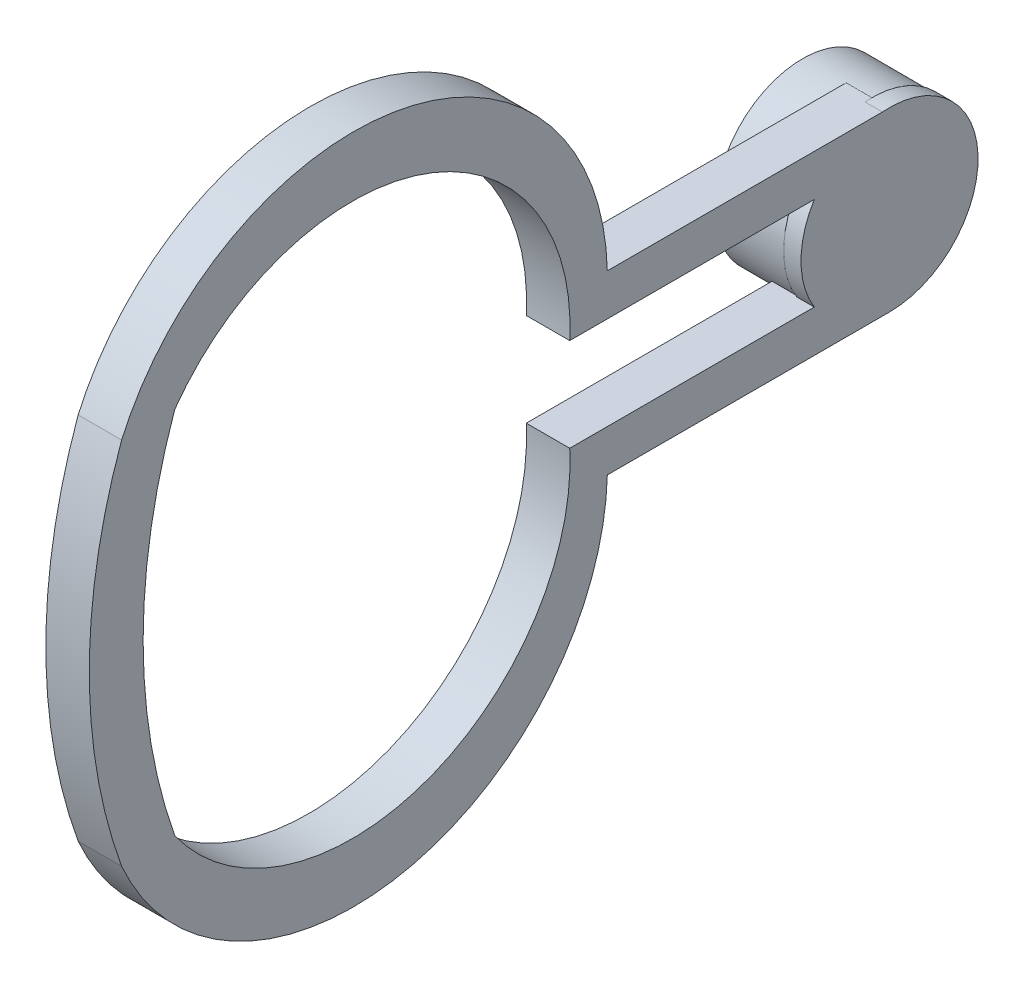
ISO-10303-21;
HEADER;
FILE_DESCRIPTION(('STEP AP214'),'2;1');
FILE_NAME('part.step','',(''),(''),'','','');
FILE_SCHEMA(('AUTOMOTIVE_DESIGN { 1 0 10303 214 1 1 1 1 }'));
ENDSEC;
DATA;
#1=APPLICATION_CONTEXT('core data for automotive mechanical design processes');
#2=APPLICATION_PROTOCOL_DEFINITION('international standard','automotive_design',2000,#1);
#3=PRODUCT_CONTEXT('',#1,'mechanical');
#4=PRODUCT('Part','Part','',(#3));
#5=PRODUCT_RELATED_PRODUCT_CATEGORY('part','',(#4));
#6=PRODUCT_DEFINITION_FORMATION('','',#4);
#7=PRODUCT_DEFINITION_CONTEXT('part definition',#1,'design');
#8=PRODUCT_DEFINITION('design','',#6,#7);
#9=PRODUCT_DEFINITION_SHAPE('','',#8);
#10=(LENGTH_UNIT() NAMED_UNIT(*) SI_UNIT(.MILLI.,.METRE.));
#11=(NAMED_UNIT(*) PLANE_ANGLE_UNIT() SI_UNIT($,.RADIAN.));
#12=(NAMED_UNIT(*) SI_UNIT($,.STERADIAN.) SOLID_ANGLE_UNIT());
#13=UNCERTAINTY_MEASURE_WITH_UNIT(LENGTH_MEASURE(1.E-05),#10,'distance_accuracy_value','');
#14=(GEOMETRIC_REPRESENTATION_CONTEXT(3) GLOBAL_UNCERTAINTY_ASSIGNED_CONTEXT((#13)) GLOBAL_UNIT_ASSIGNED_CONTEXT((#10,
#11,#12)) REPRESENTATION_CONTEXT('',''));
#15=CARTESIAN_POINT('',(0.,0.,0.));
#16=DIRECTION('',(0.,0.,1.));
#17=DIRECTION('',(1.,0.,0.));
#18=AXIS2_PLACEMENT_3D('',#15,#16,#17);
#19=CARTESIAN_POINT('',(2.032,2.7231335401423,0.));
#20=DIRECTION('',(0.,-1.,0.));
#21=DIRECTION('',(0.,0.,-1.));
#22=AXIS2_PLACEMENT_3D('',#19,#20,#21);
#23=PLANE('',#22);
#24=DIRECTION('',(0.,0.,1.));
#25=VECTOR('',#24,1.);
#26=CARTESIAN_POINT('',(-0.508,2.7231335401423,0.));
#27=LINE('',#26,#25);
#28=CARTESIAN_POINT('',(-0.508,2.7231335401423,4.32551958677977));
#29=VERTEX_POINT('',#28);
#30=CARTESIAN_POINT('',(-0.508,2.72313354014231,18.6868210524946));
#31=VERTEX_POINT('',#30);
#32=EDGE_CURVE('E166',#29,#31,#27,.T.);
#33=ORIENTED_EDGE('',*,*,#32,.F.);
#34=DIRECTION('',(1.,0.,0.));
#35=VECTOR('',#34,1.);
#36=CARTESIAN_POINT('',(-3.048,2.7231335401423,4.32551958677977));
#37=LINE('',#36,#35);
#38=CARTESIAN_POINT('',(1.016,2.7231335401423,4.32551958677977));
#39=VERTEX_POINT('',#38);
#40=EDGE_CURVE('E159',#29,#39,#37,.T.);
#41=ORIENTED_EDGE('',*,*,#40,.T.);
#42=DIRECTION('',(0.,0.,-1.));
#43=VECTOR('',#42,1.);
#44=CARTESIAN_POINT('',(1.016,2.7231335401423,0.));
#45=LINE('',#44,#43);
#46=CARTESIAN_POINT('',(1.016,2.7231335401423,4.39833654890219));
#47=VERTEX_POINT('',#46);
#48=EDGE_CURVE('E60',#47,#39,#45,.T.);
#49=ORIENTED_EDGE('',*,*,#48,.F.);
#50=DIRECTION('',(-1.,0.,0.));
#51=VECTOR('',#50,1.);
#52=CARTESIAN_POINT('',(2.032,2.7231335401423,4.39833654890219));
#53=LINE('',#52,#51);
#54=CARTESIAN_POINT('',(2.032,2.7231335401423,4.39833654890219));
#55=VERTEX_POINT('',#54);
#56=EDGE_CURVE('E274',#55,#47,#53,.T.);
#57=ORIENTED_EDGE('',*,*,#56,.F.);
#58=DIRECTION('',(0.,0.,1.));
#59=VECTOR('',#58,1.);
#60=CARTESIAN_POINT('',(2.032,2.7231335401423,0.));
#61=LINE('',#60,#59);
#62=CARTESIAN_POINT('',(2.032,2.72313354014231,18.6868210524946));
#63=VERTEX_POINT('',#62);
#64=EDGE_CURVE('E213',#55,#63,#61,.T.);
#65=ORIENTED_EDGE('',*,*,#64,.T.);
#66=DIRECTION('',(-1.,0.,0.));
#67=VECTOR('',#66,1.);
#68=CARTESIAN_POINT('',(2.032,2.72313354014231,18.6868210524946));
#69=LINE('',#68,#67);
#70=EDGE_CURVE('E240',#63,#31,#69,.T.);
#71=ORIENTED_EDGE('',*,*,#70,.T.);
#72=EDGE_LOOP('',(#33,#41,#49,#57,#65,#71));
#73=FACE_BOUND('',#72,.T.);
#74=ADVANCED_FACE('F38',(#73),#23,.T.);
#75=CARTESIAN_POINT('',(2.032,2.7231335401423,0.));
#76=DIRECTION('',(0.,0.,-1.));
#77=DIRECTION('',(-1.,0.,0.));
#78=AXIS2_PLACEMENT_3D('',#75,#76,#77);
#79=PLANE('',#78);
#80=DIRECTION('',(0.,1.,0.));
#81=VECTOR('',#80,1.);
#82=CARTESIAN_POINT('',(1.016,2.7231335401423,0.));
#83=LINE('',#82,#81);
#84=CARTESIAN_POINT('',(1.016,5.11131841828147,0.));
#85=VERTEX_POINT('',#84);
#86=CARTESIAN_POINT('',(1.016,5.15660667009038,0.));
#87=VERTEX_POINT('',#86);
#88=EDGE_CURVE('E174',#85,#87,#83,.T.);
#89=ORIENTED_EDGE('',*,*,#88,.F.);
#90=DIRECTION('',(1.,0.,0.));
#91=VECTOR('',#90,1.);
#92=CARTESIAN_POINT('',(-3.048,5.11131841828147,0.));
#93=LINE('',#92,#91);
#94=CARTESIAN_POINT('',(-0.508,5.11131841828147,0.));
#95=VERTEX_POINT('',#94);
#96=EDGE_CURVE('E168',#85,#95,#93,.F.);
#97=ORIENTED_EDGE('',*,*,#96,.T.);
#98=DIRECTION('',(0.,-1.,0.));
#99=VECTOR('',#98,1.);
#100=CARTESIAN_POINT('',(-0.508,2.7231335401423,0.));
#101=LINE('',#100,#99);
#102=CARTESIAN_POINT('',(-0.508,5.15660667009038,0.));
#103=VERTEX_POINT('',#102);
#104=EDGE_CURVE('E210',#103,#95,#101,.T.);
#105=ORIENTED_EDGE('',*,*,#104,.F.);
#106=DIRECTION('',(-1.,0.,0.));
#107=VECTOR('',#106,1.);
#108=CARTESIAN_POINT('',(2.032,5.15660667009038,0.));
#109=LINE('',#108,#107);
#110=EDGE_CURVE('E241',#87,#103,#109,.T.);
#111=ORIENTED_EDGE('',*,*,#110,.F.);
#112=EDGE_LOOP('',(#89,#97,#105,#111));
#113=FACE_BOUND('',#112,.T.);
#114=ADVANCED_FACE('F325',(#113),#79,.T.);
#115=CARTESIAN_POINT('',(2.032,-2.7231335401423,0.));
#116=DIRECTION('',(0.,0.,-1.));
#117=DIRECTION('',(-1.,0.,0.));
#118=AXIS2_PLACEMENT_3D('',#115,#116,#117);
#119=PLANE('',#118);
#120=DIRECTION('',(0.,-1.,0.));
#121=VECTOR('',#120,1.);
#122=CARTESIAN_POINT('',(-0.508,-2.7231335401423,0.));
#123=LINE('',#122,#121);
#124=CARTESIAN_POINT('',(-0.508,-5.11131841828147,0.));
#125=VERTEX_POINT('',#124);
#126=CARTESIAN_POINT('',(-0.508,-5.17308618475053,0.));
#127=VERTEX_POINT('',#126);
#128=EDGE_CURVE('E193',#125,#127,#123,.T.);
#129=ORIENTED_EDGE('',*,*,#128,.F.);
#130=DIRECTION('',(1.,0.,0.));
#131=VECTOR('',#130,1.);
#132=CARTESIAN_POINT('',(-3.048,-5.11131841828147,0.));
#133=LINE('',#132,#131);
#134=CARTESIAN_POINT('',(1.016,-5.11131841828147,0.));
#135=VERTEX_POINT('',#134);
#136=EDGE_CURVE('E276',#125,#135,#133,.T.);
#137=ORIENTED_EDGE('',*,*,#136,.T.);
#138=DIRECTION('',(0.,1.,0.));
#139=VECTOR('',#138,1.);
#140=CARTESIAN_POINT('',(1.016,-2.7231335401423,0.));
#141=LINE('',#140,#139);
#142=CARTESIAN_POINT('',(1.016,-5.17308618475053,0.));
#143=VERTEX_POINT('',#142);
#144=EDGE_CURVE('E287',#143,#135,#141,.T.);
#145=ORIENTED_EDGE('',*,*,#144,.F.);
#146=DIRECTION('',(-1.,0.,0.));
#147=VECTOR('',#146,1.);
#148=CARTESIAN_POINT('',(2.032,-5.17308618475053,0.));
#149=LINE('',#148,#147);
#150=EDGE_CURVE('E254',#143,#127,#149,.T.);
#151=ORIENTED_EDGE('',*,*,#150,.T.);
#152=EDGE_LOOP('',(#129,#137,#145,#151));
#153=FACE_BOUND('',#152,.T.);
#154=ADVANCED_FACE('F322',(#153),#119,.T.);
#155=CARTESIAN_POINT('',(2.032,-2.7231335401423,0.));
#156=DIRECTION('',(0.,1.,0.));
#157=DIRECTION('',(0.,0.,1.));
#158=AXIS2_PLACEMENT_3D('',#155,#156,#157);
#159=PLANE('',#158);
#160=DIRECTION('',(0.,0.,1.));
#161=VECTOR('',#160,1.);
#162=CARTESIAN_POINT('',(1.016,-2.7231335401423,0.));
#163=LINE('',#162,#161);
#164=CARTESIAN_POINT('',(1.016,-2.7231335401423,4.32551958677977));
#165=VERTEX_POINT('',#164);
#166=CARTESIAN_POINT('',(1.016,-2.7231335401423,4.39833654890219));
#167=VERTEX_POINT('',#166);
#168=EDGE_CURVE('E163',#165,#167,#163,.T.);
#169=ORIENTED_EDGE('',*,*,#168,.F.);
#170=DIRECTION('',(1.,0.,0.));
#171=VECTOR('',#170,1.);
#172=CARTESIAN_POINT('',(-3.048,-2.7231335401423,4.32551958677977));
#173=LINE('',#172,#171);
#174=CARTESIAN_POINT('',(-0.508,-2.7231335401423,4.32551958677977));
#175=VERTEX_POINT('',#174);
#176=EDGE_CURVE('E52',#165,#175,#173,.F.);
#177=ORIENTED_EDGE('',*,*,#176,.T.);
#178=DIRECTION('',(0.,0.,-1.));
#179=VECTOR('',#178,1.);
#180=CARTESIAN_POINT('',(-0.508,-2.7231335401423,0.));
#181=LINE('',#180,#179);
#182=CARTESIAN_POINT('',(-0.508,-2.7231335401423,18.6868210524946));
#183=VERTEX_POINT('',#182);
#184=EDGE_CURVE('E190',#183,#175,#181,.T.);
#185=ORIENTED_EDGE('',*,*,#184,.F.);
#186=DIRECTION('',(-1.,0.,0.));
#187=VECTOR('',#186,1.);
#188=CARTESIAN_POINT('',(2.032,-2.7231335401423,18.6868210524946));
#189=LINE('',#188,#187);
#190=CARTESIAN_POINT('',(2.032,-2.7231335401423,18.6868210524946));
#191=VERTEX_POINT('',#190);
#192=EDGE_CURVE('E255',#191,#183,#189,.T.);
#193=ORIENTED_EDGE('',*,*,#192,.F.);
#194=DIRECTION('',(0.,0.,-1.));
#195=VECTOR('',#194,1.);
#196=CARTESIAN_POINT('',(2.032,-2.7231335401423,0.));
#197=LINE('',#196,#195);
#198=CARTESIAN_POINT('',(2.032,-2.7231335401423,4.39833654890219));
#199=VERTEX_POINT('',#198);
#200=EDGE_CURVE('E224',#191,#199,#197,.T.);
#201=ORIENTED_EDGE('',*,*,#200,.T.);
#202=DIRECTION('',(-1.,0.,0.));
#203=VECTOR('',#202,1.);
#204=CARTESIAN_POINT('',(2.032,-2.7231335401423,4.39833654890219));
#205=LINE('',#204,#203);
#206=EDGE_CURVE('E264',#167,#199,#205,.F.);
#207=ORIENTED_EDGE('',*,*,#206,.F.);
#208=EDGE_LOOP('',(#169,#177,#185,#193,#201,#207));
#209=FACE_BOUND('',#208,.T.);
#210=ADVANCED_FACE('F265',(#209),#159,.T.);
#211=CARTESIAN_POINT('',(1.016,0.,0.));
#212=DIRECTION('',(-1.,0.,0.));
#213=DIRECTION('',(0.,0.,1.));
#214=AXIS2_PLACEMENT_3D('',#211,#212,#213);
#215=PLANE('',#214);
#216=ORIENTED_EDGE('',*,*,#144,.T.);
#217=CARTESIAN_POINT('',(1.016,0.,0.));
#218=DIRECTION('',(-1.,0.,0.));
#219=DIRECTION('',(0.,0.,1.));
#220=AXIS2_PLACEMENT_3D('',#217,#218,#219);
#221=CIRCLE('',#220,5.11131841828147);
#222=EDGE_CURVE('E11',#135,#85,#221,.F.);
#223=ORIENTED_EDGE('',*,*,#222,.T.);
#224=ORIENTED_EDGE('',*,*,#88,.T.);
#225=DIRECTION('',(0.,0.,1.));
#226=VECTOR('',#225,1.);
#227=CARTESIAN_POINT('',(1.016,5.15660667009038,0.));
#228=LINE('',#227,#226);
#229=CARTESIAN_POINT('',(1.016,5.15660667009038,0.41258735418842));
#230=VERTEX_POINT('',#229);
#231=EDGE_CURVE('E178',#87,#230,#228,.T.);
#232=ORIENTED_EDGE('',*,*,#231,.T.);
#233=CARTESIAN_POINT('',(1.016,0.,0.));
#234=DIRECTION('',(-1.,0.,0.));
#235=DIRECTION('',(0.,0.,1.));
#236=AXIS2_PLACEMENT_3D('',#233,#234,#235);
#237=CIRCLE('',#236,5.17308618475053);
#238=EDGE_CURVE('E275',#230,#143,#237,.T.);
#239=ORIENTED_EDGE('',*,*,#238,.T.);
#240=EDGE_LOOP('',(#216,#223,#224,#232,#239));
#241=FACE_BOUND('',#240,.T.);
#242=ADVANCED_FACE('F293',(#241),#215,.T.);
#243=CARTESIAN_POINT('',(2.032,5.15660667009038,0.));
#244=DIRECTION('',(0.,1.,0.));
#245=DIRECTION('',(0.,0.,1.));
#246=AXIS2_PLACEMENT_3D('',#243,#244,#245);
#247=PLANE('',#246);
#248=DIRECTION('',(-1.,0.,0.));
#249=VECTOR('',#248,1.);
#250=CARTESIAN_POINT('',(2.032,5.15660667009038,0.41258735418842));
#251=LINE('',#250,#249);
#252=CARTESIAN_POINT('',(2.032,5.15660667009038,0.41258735418842));
#253=VERTEX_POINT('',#252);
#254=EDGE_CURVE('E270',#230,#253,#251,.F.);
#255=ORIENTED_EDGE('',*,*,#254,.F.);
#256=ORIENTED_EDGE('',*,*,#231,.F.);
#257=ORIENTED_EDGE('',*,*,#110,.T.);
#258=DIRECTION('',(0.,0.,-1.));
#259=VECTOR('',#258,1.);
#260=CARTESIAN_POINT('',(-0.508,5.15660667009038,0.));
#261=LINE('',#260,#259);
#262=CARTESIAN_POINT('',(-0.508,5.15660667009038,16.4899016936356));
#263=VERTEX_POINT('',#262);
#264=EDGE_CURVE('E207',#263,#103,#261,.T.);
#265=ORIENTED_EDGE('',*,*,#264,.F.);
#266=DIRECTION('',(-1.,0.,0.));
#267=VECTOR('',#266,1.);
#268=CARTESIAN_POINT('',(2.032,5.15660667009038,16.4899016936356));
#269=LINE('',#268,#267);
#270=CARTESIAN_POINT('',(2.032,5.15660667009038,16.4899016936356));
#271=VERTEX_POINT('',#270);
#272=EDGE_CURVE('E243',#271,#263,#269,.T.);
#273=ORIENTED_EDGE('',*,*,#272,.F.);
#274=DIRECTION('',(0.,0.,-1.));
#275=VECTOR('',#274,1.);
#276=CARTESIAN_POINT('',(2.032,5.15660667009038,0.));
#277=LINE('',#276,#275);
#278=EDGE_CURVE('E238',#271,#253,#277,.T.);
#279=ORIENTED_EDGE('',*,*,#278,.T.);
#280=EDGE_LOOP('',(#255,#256,#257,#265,#273,#279));
#281=FACE_BOUND('',#280,.T.);
#282=ADVANCED_FACE('F328',(#281),#247,.T.);
#283=CARTESIAN_POINT('',(2.032,4.78990959976833,31.3119410377967));
#284=DIRECTION('',(-1.,0.,0.));
#285=DIRECTION('',(0.,0.,1.));
#286=AXIS2_PLACEMENT_3D('',#283,#284,#285);
#287=CYLINDRICAL_SURFACE('',#286,14.8265746907788);
#288=ORIENTED_EDGE('',*,*,#272,.T.);
#289=CARTESIAN_POINT('',(-0.508,4.78990959976833,31.3119410377967));
#290=DIRECTION('',(-1.,0.,0.));
#291=DIRECTION('',(0.,0.,-1.));
#292=AXIS2_PLACEMENT_3D('',#289,#290,#291);
#293=CIRCLE('',#292,14.8265746907788);
#294=CARTESIAN_POINT('',(-0.508,10.7868432442019,44.8715908830361));
#295=VERTEX_POINT('',#294);
#296=EDGE_CURVE('E204',#295,#263,#293,.T.);
#297=ORIENTED_EDGE('',*,*,#296,.F.);
#298=DIRECTION('',(-1.,0.,0.));
#299=VECTOR('',#298,1.);
#300=CARTESIAN_POINT('',(2.032,10.7868432442019,44.8715908830361));
#301=LINE('',#300,#299);
#302=CARTESIAN_POINT('',(2.032,10.7868432442019,44.8715908830361));
#303=VERTEX_POINT('',#302);
#304=EDGE_CURVE('E245',#303,#295,#301,.T.);
#305=ORIENTED_EDGE('',*,*,#304,.F.);
#306=CARTESIAN_POINT('',(2.032,4.78990959976833,31.3119410377967));
#307=DIRECTION('',(-1.,0.,0.));
#308=DIRECTION('',(0.,0.,-1.));
#309=AXIS2_PLACEMENT_3D('',#306,#307,#308);
#310=CIRCLE('',#309,14.8265746907788);
#311=EDGE_CURVE('E235',#303,#271,#310,.T.);
#312=ORIENTED_EDGE('',*,*,#311,.T.);
#313=EDGE_LOOP('',(#288,#297,#305,#312));
#314=FACE_BOUND('',#313,.T.);
#315=ADVANCED_FACE('F331',(#314),#287,.T.);
#316=CARTESIAN_POINT('',(2.032,0.,15.0412876610944));
#317=DIRECTION('',(-1.,0.,0.));
#318=DIRECTION('',(0.,0.,1.));
#319=AXIS2_PLACEMENT_3D('',#316,#317,#318);
#320=CYLINDRICAL_SURFACE('',#319,31.7207026638436);
#321=ORIENTED_EDGE('',*,*,#304,.T.);
#322=CARTESIAN_POINT('',(-0.508,0.,15.0412876610944));
#323=DIRECTION('',(-1.,0.,0.));
#324=DIRECTION('',(0.,0.,-1.));
#325=AXIS2_PLACEMENT_3D('',#322,#323,#324);
#326=CIRCLE('',#325,31.7207026638436);
#327=CARTESIAN_POINT('',(-0.508,-10.7868432442019,44.8715908830362));
#328=VERTEX_POINT('',#327);
#329=EDGE_CURVE('E201',#328,#295,#326,.T.);
#330=ORIENTED_EDGE('',*,*,#329,.F.);
#331=DIRECTION('',(-1.,0.,0.));
#332=VECTOR('',#331,1.);
#333=CARTESIAN_POINT('',(2.032,-10.7868432442019,44.8715908830362));
#334=LINE('',#333,#332);
#335=CARTESIAN_POINT('',(2.032,-10.7868432442019,44.8715908830362));
#336=VERTEX_POINT('',#335);
#337=EDGE_CURVE('E247',#336,#328,#334,.T.);
#338=ORIENTED_EDGE('',*,*,#337,.F.);
#339=CARTESIAN_POINT('',(2.032,0.,15.0412876610944));
#340=DIRECTION('',(-1.,0.,0.));
#341=DIRECTION('',(0.,0.,-1.));
#342=AXIS2_PLACEMENT_3D('',#339,#340,#341);
#343=CIRCLE('',#342,31.7207026638436);
#344=EDGE_CURVE('E232',#336,#303,#343,.T.);
#345=ORIENTED_EDGE('',*,*,#344,.T.);
#346=EDGE_LOOP('',(#321,#330,#338,#345));
#347=FACE_BOUND('',#346,.T.);
#348=ADVANCED_FACE('F333',(#347),#320,.T.);
#349=CARTESIAN_POINT('',(2.032,-4.78990959976833,31.3119410377967));
#350=DIRECTION('',(-1.,0.,0.));
#351=DIRECTION('',(0.,0.,1.));
#352=AXIS2_PLACEMENT_3D('',#349,#350,#351);
#353=CYLINDRICAL_SURFACE('',#352,14.8265746907788);
#354=ORIENTED_EDGE('',*,*,#337,.T.);
#355=CARTESIAN_POINT('',(-0.508,-4.78990959976833,31.3119410377967));
#356=DIRECTION('',(-1.,0.,0.));
#357=DIRECTION('',(0.,0.,1.));
#358=AXIS2_PLACEMENT_3D('',#355,#356,#357);
#359=CIRCLE('',#358,14.8265746907788);
#360=CARTESIAN_POINT('',(-0.508,-5.17308618475053,16.4903185636556));
#361=VERTEX_POINT('',#360);
#362=EDGE_CURVE('E198',#361,#328,#359,.T.);
#363=ORIENTED_EDGE('',*,*,#362,.F.);
#364=DIRECTION('',(-1.,0.,0.));
#365=VECTOR('',#364,1.);
#366=CARTESIAN_POINT('',(2.032,-5.17308618475053,16.4903185636556));
#367=LINE('',#366,#365);
#368=CARTESIAN_POINT('',(2.032,-5.17308618475053,16.4903185636556));
#369=VERTEX_POINT('',#368);
#370=EDGE_CURVE('E249',#369,#361,#367,.T.);
#371=ORIENTED_EDGE('',*,*,#370,.F.);
#372=CARTESIAN_POINT('',(2.032,-4.78990959976833,31.3119410377967));
#373=DIRECTION('',(-1.,0.,0.));
#374=DIRECTION('',(0.,0.,1.));
#375=AXIS2_PLACEMENT_3D('',#372,#373,#374);
#376=CIRCLE('',#375,14.8265746907788);
#377=EDGE_CURVE('E229',#369,#336,#376,.T.);
#378=ORIENTED_EDGE('',*,*,#377,.T.);
#379=EDGE_LOOP('',(#354,#363,#371,#378));
#380=FACE_BOUND('',#379,.T.);
#381=ADVANCED_FACE('F314',(#380),#353,.T.);
#382=CARTESIAN_POINT('',(2.032,-5.17308618475053,0.));
#383=DIRECTION('',(0.,-1.,0.));
#384=DIRECTION('',(0.,0.,-1.));
#385=AXIS2_PLACEMENT_3D('',#382,#383,#384);
#386=PLANE('',#385);
#387=ORIENTED_EDGE('',*,*,#370,.T.);
#388=DIRECTION('',(0.,0.,1.));
#389=VECTOR('',#388,1.);
#390=CARTESIAN_POINT('',(-0.508,-5.17308618475053,0.));
#391=LINE('',#390,#389);
#392=EDGE_CURVE('E195',#127,#361,#391,.T.);
#393=ORIENTED_EDGE('',*,*,#392,.F.);
#394=ORIENTED_EDGE('',*,*,#150,.F.);
#395=CARTESIAN_POINT('',(2.032,-5.17308618475053,0.));
#396=VERTEX_POINT('',#395);
#397=EDGE_CURVE('E251',#396,#143,#149,.T.);
#398=ORIENTED_EDGE('',*,*,#397,.F.);
#399=DIRECTION('',(0.,0.,1.));
#400=VECTOR('',#399,1.);
#401=CARTESIAN_POINT('',(2.032,-5.17308618475053,0.));
#402=LINE('',#401,#400);
#403=EDGE_CURVE('E226',#396,#369,#402,.T.);
#404=ORIENTED_EDGE('',*,*,#403,.T.);
#405=EDGE_LOOP('',(#387,#393,#394,#398,#404));
#406=FACE_BOUND('',#405,.T.);
#407=ADVANCED_FACE('F304',(#406),#386,.T.);
#408=CARTESIAN_POINT('',(2.032,-3.39941433420158,31.3989644799941));
#409=DIRECTION('',(-1.,0.,0.));
#410=DIRECTION('',(0.,0.,1.));
#411=AXIS2_PLACEMENT_3D('',#408,#409,#410);
#412=CYLINDRICAL_SURFACE('',#411,12.730119647267);
#413=ORIENTED_EDGE('',*,*,#192,.T.);
#414=CARTESIAN_POINT('',(-0.508,-3.39941433420158,31.3989644799941));
#415=DIRECTION('',(1.,0.,0.));
#416=DIRECTION('',(0.,0.,1.));
#417=AXIS2_PLACEMENT_3D('',#414,#415,#416);
#418=CIRCLE('',#417,12.730119647267);
#419=CARTESIAN_POINT('',(-0.508,-10.7868432441993,41.7663093827869));
#420=VERTEX_POINT('',#419);
#421=EDGE_CURVE('E187',#420,#183,#418,.T.);
#422=ORIENTED_EDGE('',*,*,#421,.F.);
#423=DIRECTION('',(-1.,0.,0.));
#424=VECTOR('',#423,1.);
#425=CARTESIAN_POINT('',(2.032,-10.7868432441993,41.7663093827869));
#426=LINE('',#425,#424);
#427=CARTESIAN_POINT('',(2.032,-10.7868432441993,41.7663093827869));
#428=VERTEX_POINT('',#427);
#429=EDGE_CURVE('E257',#428,#420,#426,.T.);
#430=ORIENTED_EDGE('',*,*,#429,.F.);
#431=CARTESIAN_POINT('',(2.032,-3.39941433420158,31.3989644799941));
#432=DIRECTION('',(1.,0.,0.));
#433=DIRECTION('',(0.,0.,1.));
#434=AXIS2_PLACEMENT_3D('',#431,#432,#433);
#435=CIRCLE('',#434,12.730119647267);
#436=EDGE_CURVE('E221',#428,#191,#435,.T.);
#437=ORIENTED_EDGE('',*,*,#436,.T.);
#438=EDGE_LOOP('',(#413,#422,#430,#437));
#439=FACE_BOUND('',#438,.T.);
#440=ADVANCED_FACE('F398',(#439),#412,.F.);
#441=CARTESIAN_POINT('',(2.032,0.,11.2390693222313));
#442=DIRECTION('',(-1.,0.,0.));
#443=DIRECTION('',(0.,0.,1.));
#444=AXIS2_PLACEMENT_3D('',#441,#442,#443);
#445=CYLINDRICAL_SURFACE('',#444,32.3769728802697);
#446=ORIENTED_EDGE('',*,*,#429,.T.);
#447=CARTESIAN_POINT('',(-0.508,0.,11.2390693222313));
#448=DIRECTION('',(1.,0.,0.));
#449=DIRECTION('',(0.,0.,-1.));
#450=AXIS2_PLACEMENT_3D('',#447,#448,#449);
#451=CIRCLE('',#450,32.3769728802697);
#452=CARTESIAN_POINT('',(-0.508,10.7868432441993,41.7663093827869));
#453=VERTEX_POINT('',#452);
#454=EDGE_CURVE('E184',#453,#420,#451,.T.);
#455=ORIENTED_EDGE('',*,*,#454,.F.);
#456=DIRECTION('',(-1.,0.,0.));
#457=VECTOR('',#456,1.);
#458=CARTESIAN_POINT('',(2.032,10.7868432441993,41.7663093827869));
#459=LINE('',#458,#457);
#460=CARTESIAN_POINT('',(2.032,10.7868432441993,41.7663093827869));
#461=VERTEX_POINT('',#460);
#462=EDGE_CURVE('E259',#461,#453,#459,.T.);
#463=ORIENTED_EDGE('',*,*,#462,.F.);
#464=CARTESIAN_POINT('',(2.032,0.,11.2390693222313));
#465=DIRECTION('',(1.,0.,0.));
#466=DIRECTION('',(0.,0.,-1.));
#467=AXIS2_PLACEMENT_3D('',#464,#465,#466);
#468=CIRCLE('',#467,32.3769728802697);
#469=EDGE_CURVE('E218',#461,#428,#468,.T.);
#470=ORIENTED_EDGE('',*,*,#469,.T.);
#471=EDGE_LOOP('',(#446,#455,#463,#470));
#472=FACE_BOUND('',#471,.T.);
#473=ADVANCED_FACE('F386',(#472),#445,.F.);
#474=CARTESIAN_POINT('',(2.032,3.39941433420158,31.3989644799941));
#475=DIRECTION('',(-1.,0.,0.));
#476=DIRECTION('',(0.,0.,1.));
#477=AXIS2_PLACEMENT_3D('',#474,#475,#476);
#478=CYLINDRICAL_SURFACE('',#477,12.730119647267);
#479=ORIENTED_EDGE('',*,*,#462,.T.);
#480=CARTESIAN_POINT('',(-0.508,3.39941433420158,31.3989644799941));
#481=DIRECTION('',(1.,0.,0.));
#482=DIRECTION('',(0.,0.,-1.));
#483=AXIS2_PLACEMENT_3D('',#480,#481,#482);
#484=CIRCLE('',#483,12.730119647267);
#485=EDGE_CURVE('E176',#31,#453,#484,.T.);
#486=ORIENTED_EDGE('',*,*,#485,.F.);
#487=ORIENTED_EDGE('',*,*,#70,.F.);
#488=CARTESIAN_POINT('',(2.032,3.39941433420158,31.3989644799941));
#489=DIRECTION('',(1.,0.,0.));
#490=DIRECTION('',(0.,0.,-1.));
#491=AXIS2_PLACEMENT_3D('',#488,#489,#490);
#492=CIRCLE('',#491,12.730119647267);
#493=EDGE_CURVE('E215',#63,#461,#492,.T.);
#494=ORIENTED_EDGE('',*,*,#493,.T.);
#495=EDGE_LOOP('',(#479,#486,#487,#494));
#496=FACE_BOUND('',#495,.T.);
#497=ADVANCED_FACE('F381',(#496),#478,.F.);
#498=CARTESIAN_POINT('',(2.032,3.39941433420158,31.3989644799941));
#499=DIRECTION('',(1.,0.,0.));
#500=DIRECTION('',(0.,0.,-1.));
#501=AXIS2_PLACEMENT_3D('',#498,#499,#500);
#502=PLANE('',#501);
#503=ORIENTED_EDGE('',*,*,#64,.F.);
#504=CARTESIAN_POINT('',(2.032,0.,0.));
#505=DIRECTION('',(-1.,0.,0.));
#506=DIRECTION('',(0.,0.,1.));
#507=AXIS2_PLACEMENT_3D('',#504,#505,#506);
#508=CIRCLE('',#507,5.17308618475053);
#509=EDGE_CURVE('E279',#199,#55,#508,.T.);
#510=ORIENTED_EDGE('',*,*,#509,.F.);
#511=ORIENTED_EDGE('',*,*,#200,.F.);
#512=ORIENTED_EDGE('',*,*,#436,.F.);
#513=ORIENTED_EDGE('',*,*,#469,.F.);
#514=ORIENTED_EDGE('',*,*,#493,.F.);
#515=EDGE_LOOP('',(#503,#510,#511,#512,#513,#514));
#516=FACE_BOUND('',#515,.T.);
#517=ORIENTED_EDGE('',*,*,#403,.F.);
#518=EDGE_CURVE('E271',#253,#396,#508,.T.);
#519=ORIENTED_EDGE('',*,*,#518,.F.);
#520=ORIENTED_EDGE('',*,*,#278,.F.);
#521=ORIENTED_EDGE('',*,*,#311,.F.);
#522=ORIENTED_EDGE('',*,*,#344,.F.);
#523=ORIENTED_EDGE('',*,*,#377,.F.);
#524=EDGE_LOOP('',(#517,#519,#520,#521,#522,#523));
#525=FACE_BOUND('',#524,.T.);
#526=ADVANCED_FACE('F309',(#516,#525),#502,.T.);
#527=CARTESIAN_POINT('',(-0.508,3.39941433420158,31.3989644799941));
#528=DIRECTION('',(1.,0.,0.));
#529=DIRECTION('',(0.,0.,-1.));
#530=AXIS2_PLACEMENT_3D('',#527,#528,#529);
#531=PLANE('',#530);
#532=CARTESIAN_POINT('',(-0.508,0.,0.));
#533=DIRECTION('',(1.,0.,0.));
#534=DIRECTION('',(0.,0.,-1.));
#535=AXIS2_PLACEMENT_3D('',#532,#533,#534);
#536=CIRCLE('',#535,5.11131841828147);
#537=EDGE_CURVE('E167',#125,#175,#536,.F.);
#538=ORIENTED_EDGE('',*,*,#537,.F.);
#539=ORIENTED_EDGE('',*,*,#128,.T.);
#540=ORIENTED_EDGE('',*,*,#392,.T.);
#541=ORIENTED_EDGE('',*,*,#362,.T.);
#542=ORIENTED_EDGE('',*,*,#329,.T.);
#543=ORIENTED_EDGE('',*,*,#296,.T.);
#544=ORIENTED_EDGE('',*,*,#264,.T.);
#545=ORIENTED_EDGE('',*,*,#104,.T.);
#546=EDGE_CURVE('E402',#29,#95,#536,.F.);
#547=ORIENTED_EDGE('',*,*,#546,.F.);
#548=ORIENTED_EDGE('',*,*,#32,.T.);
#549=ORIENTED_EDGE('',*,*,#485,.T.);
#550=ORIENTED_EDGE('',*,*,#454,.T.);
#551=ORIENTED_EDGE('',*,*,#421,.T.);
#552=ORIENTED_EDGE('',*,*,#184,.T.);
#553=EDGE_LOOP('',(#538,#539,#540,#541,#542,#543,#544,#545,#547,#548,#549,#550,#551,#552));
#554=FACE_BOUND('',#553,.T.);
#555=ADVANCED_FACE('F318',(#554),#531,.F.);
#556=CARTESIAN_POINT('',(2.032,0.,0.));
#557=DIRECTION('',(-1.,0.,0.));
#558=DIRECTION('',(0.,0.,1.));
#559=AXIS2_PLACEMENT_3D('',#556,#557,#558);
#560=CYLINDRICAL_SURFACE('',#559,5.17308618475053);
#561=ORIENTED_EDGE('',*,*,#509,.T.);
#562=ORIENTED_EDGE('',*,*,#56,.T.);
#563=EDGE_CURVE('E173',#167,#47,#237,.T.);
#564=ORIENTED_EDGE('',*,*,#563,.F.);
#565=ORIENTED_EDGE('',*,*,#206,.T.);
#566=EDGE_LOOP('',(#561,#562,#564,#565));
#567=FACE_BOUND('',#566,.T.);
#568=ADVANCED_FACE('F273',(#567),#560,.T.);
#569=ORIENTED_EDGE('',*,*,#238,.F.);
#570=ORIENTED_EDGE('',*,*,#254,.T.);
#571=ORIENTED_EDGE('',*,*,#518,.T.);
#572=ORIENTED_EDGE('',*,*,#397,.T.);
#573=EDGE_LOOP('',(#569,#570,#571,#572));
#574=FACE_BOUND('',#573,.T.);
#575=ADVANCED_FACE('F298',(#574),#560,.T.);
#576=ORIENTED_EDGE('',*,*,#48,.T.);
#577=EDGE_CURVE('E41',#39,#165,#221,.F.);
#578=ORIENTED_EDGE('',*,*,#577,.T.);
#579=ORIENTED_EDGE('',*,*,#168,.T.);
#580=ORIENTED_EDGE('',*,*,#563,.T.);
#581=EDGE_LOOP('',(#576,#578,#579,#580));
#582=FACE_BOUND('',#581,.T.);
#583=ADVANCED_FACE('F171',(#582),#215,.T.);
#584=CARTESIAN_POINT('',(-3.048,0.,0.));
#585=DIRECTION('',(-1.,0.,0.));
#586=DIRECTION('',(0.,0.,1.));
#587=AXIS2_PLACEMENT_3D('',#584,#585,#586);
#588=PLANE('',#587);
#589=CARTESIAN_POINT('',(-3.048,0.,0.));
#590=DIRECTION('',(-1.,0.,0.));
#591=DIRECTION('',(0.,0.,1.));
#592=AXIS2_PLACEMENT_3D('',#589,#590,#591);
#593=CIRCLE('',#592,3.69692551324407);
#594=CARTESIAN_POINT('',(-3.048,0.,3.69692551324407));
#595=VERTEX_POINT('',#594);
#596=EDGE_CURVE('E409',#595,#595,#593,.T.);
#597=ORIENTED_EDGE('',*,*,#596,.F.);
#598=EDGE_LOOP('',(#597));
#599=FACE_BOUND('',#598,.T.);
#600=CARTESIAN_POINT('',(-3.048,0.,0.));
#601=DIRECTION('',(-1.,0.,0.));
#602=DIRECTION('',(0.,0.,1.));
#603=AXIS2_PLACEMENT_3D('',#600,#601,#602);
#604=CIRCLE('',#603,5.11131841828147);
#605=CARTESIAN_POINT('',(-3.048,0.,5.11131841828147));
#606=VERTEX_POINT('',#605);
#607=EDGE_CURVE('E405',#606,#606,#604,.T.);
#608=ORIENTED_EDGE('',*,*,#607,.T.);
#609=EDGE_LOOP('',(#608));
#610=FACE_BOUND('',#609,.T.);
#611=ADVANCED_FACE('F366',(#599,#610),#588,.T.);
#612=CARTESIAN_POINT('',(-3.048,0.,0.));
#613=DIRECTION('',(1.,0.,0.));
#614=DIRECTION('',(0.,0.,-1.));
#615=AXIS2_PLACEMENT_3D('',#612,#613,#614);
#616=CYLINDRICAL_SURFACE('',#615,5.11131841828147);
#617=ORIENTED_EDGE('',*,*,#136,.F.);
#618=ORIENTED_EDGE('',*,*,#537,.T.);
#619=ORIENTED_EDGE('',*,*,#176,.F.);
#620=ORIENTED_EDGE('',*,*,#577,.F.);
#621=ORIENTED_EDGE('',*,*,#40,.F.);
#622=ORIENTED_EDGE('',*,*,#546,.T.);
#623=ORIENTED_EDGE('',*,*,#96,.F.);
#624=ORIENTED_EDGE('',*,*,#222,.F.);
#625=EDGE_LOOP('',(#617,#618,#619,#620,#621,#622,#623,#624));
#626=FACE_BOUND('',#625,.T.);
#627=ORIENTED_EDGE('',*,*,#607,.F.);
#628=EDGE_LOOP('',(#627));
#629=FACE_BOUND('',#628,.T.);
#630=ADVANCED_FACE('F157',(#626,#629),#616,.T.);
#631=CARTESIAN_POINT('',(1.524,0.,0.));
#632=DIRECTION('',(-1.,0.,0.));
#633=DIRECTION('',(0.,0.,1.));
#634=AXIS2_PLACEMENT_3D('',#631,#632,#633);
#635=CYLINDRICAL_SURFACE('',#634,3.69692551324407);
#636=CARTESIAN_POINT('',(1.524,0.,0.));
#637=DIRECTION('',(-1.,0.,0.));
#638=DIRECTION('',(0.,0.,1.));
#639=AXIS2_PLACEMENT_3D('',#636,#637,#638);
#640=CIRCLE('',#639,3.69692551324407);
#641=CARTESIAN_POINT('',(1.524,0.,3.69692551324407));
#642=VERTEX_POINT('',#641);
#643=EDGE_CURVE('E408',#642,#642,#640,.T.);
#644=ORIENTED_EDGE('',*,*,#643,.F.);
#645=EDGE_LOOP('',(#644));
#646=FACE_BOUND('',#645,.T.);
#647=ORIENTED_EDGE('',*,*,#596,.T.);
#648=EDGE_LOOP('',(#647));
#649=FACE_BOUND('',#648,.T.);
#650=ADVANCED_FACE('F417',(#646,#649),#635,.F.);
#651=CARTESIAN_POINT('',(1.524,0.,0.));
#652=DIRECTION('',(-1.,0.,0.));
#653=DIRECTION('',(0.,0.,1.));
#654=AXIS2_PLACEMENT_3D('',#651,#652,#653);
#655=PLANE('',#654);
#656=ORIENTED_EDGE('',*,*,#643,.T.);
#657=EDGE_LOOP('',(#656));
#658=FACE_BOUND('',#657,.T.);
#659=ADVANCED_FACE('F415',(#658),#655,.T.);
#660=CLOSED_SHELL('',(#74,#114,#154,#210,#242,#282,#315,#348,#381,#407,#440,#473,#497,#526,#555,
#568,#575,#583,#611,#630,#650,#659));
#661=MANIFOLD_SOLID_BREP('B2',#660);
#662=ADVANCED_BREP_SHAPE_REPRESENTATION('',(#18,#661),#14);
#663=SHAPE_DEFINITION_REPRESENTATION(#9,#662);
ENDSEC;
END-ISO-10303-21;
